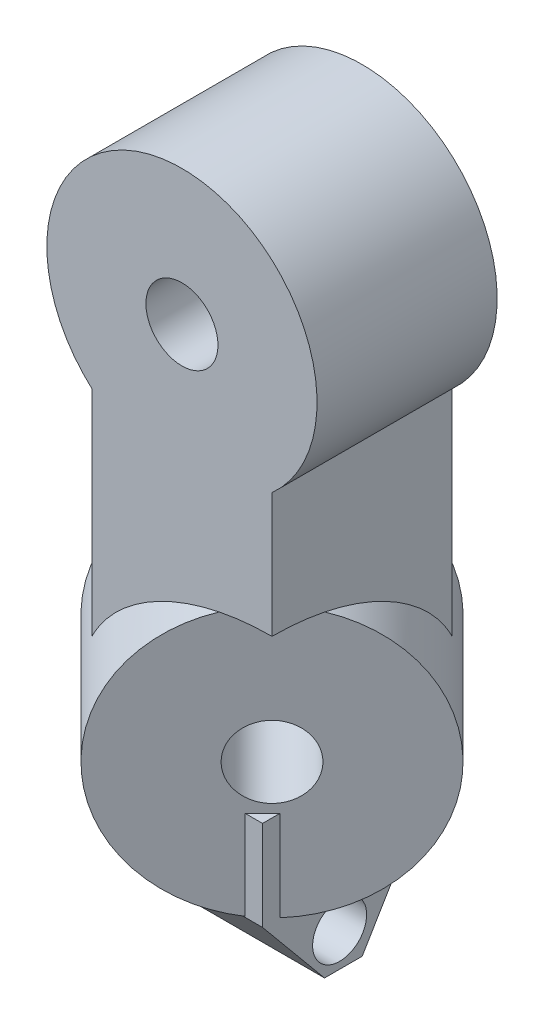
ISO-10303-21;
HEADER;
FILE_DESCRIPTION(('STEP AP214'),'2;1');
FILE_NAME('part.step','',(''),(''),'','','');
FILE_SCHEMA(('AUTOMOTIVE_DESIGN { 1 0 10303 214 1 1 1 1 }'));
ENDSEC;
DATA;
#1=APPLICATION_CONTEXT('core data for automotive mechanical design processes');
#2=APPLICATION_PROTOCOL_DEFINITION('international standard','automotive_design',2000,#1);
#3=PRODUCT_CONTEXT('',#1,'mechanical');
#4=PRODUCT('Part','Part','',(#3));
#5=PRODUCT_RELATED_PRODUCT_CATEGORY('part','',(#4));
#6=PRODUCT_DEFINITION_FORMATION('','',#4);
#7=PRODUCT_DEFINITION_CONTEXT('part definition',#1,'design');
#8=PRODUCT_DEFINITION('design','',#6,#7);
#9=PRODUCT_DEFINITION_SHAPE('','',#8);
#10=(LENGTH_UNIT() NAMED_UNIT(*) SI_UNIT(.MILLI.,.METRE.));
#11=(NAMED_UNIT(*) PLANE_ANGLE_UNIT() SI_UNIT($,.RADIAN.));
#12=(NAMED_UNIT(*) SI_UNIT($,.STERADIAN.) SOLID_ANGLE_UNIT());
#13=UNCERTAINTY_MEASURE_WITH_UNIT(LENGTH_MEASURE(1.E-05),#10,'distance_accuracy_value','');
#14=(GEOMETRIC_REPRESENTATION_CONTEXT(3) GLOBAL_UNCERTAINTY_ASSIGNED_CONTEXT((#13)) GLOBAL_UNIT_ASSIGNED_CONTEXT((#10,
#11,#12)) REPRESENTATION_CONTEXT('',''));
#15=CARTESIAN_POINT('',(0.,0.,0.));
#16=DIRECTION('',(0.,0.,1.));
#17=DIRECTION('',(1.,0.,0.));
#18=AXIS2_PLACEMENT_3D('',#15,#16,#17);
#19=CARTESIAN_POINT('',(-4.21974231725963,-12.5,1.27916126966144));
#20=DIRECTION('',(0.,0.,1.));
#21=DIRECTION('',(1.,0.,0.));
#22=AXIS2_PLACEMENT_3D('',#19,#20,#21);
#23=PLANE('',#22);
#24=DIRECTION('',(1.,0.,0.));
#25=VECTOR('',#24,1.);
#26=CARTESIAN_POINT('',(-6.21974231725963,-17.5189701101438,1.27916126966144));
#27=LINE('',#26,#25);
#28=CARTESIAN_POINT('',(-4.21974231725963,-17.5189701101438,1.27916126966144));
#29=VERTEX_POINT('',#28);
#30=CARTESIAN_POINT('',(-3.32377405507188,-17.5189701101438,1.27916126966144));
#31=VERTEX_POINT('',#30);
#32=EDGE_CURVE('E198',#29,#31,#27,.T.);
#33=ORIENTED_EDGE('',*,*,#32,.F.);
#34=DIRECTION('',(0.,-1.,0.));
#35=VECTOR('',#34,1.);
#36=CARTESIAN_POINT('',(-4.21974231725963,-12.5,1.27916126966144));
#37=LINE('',#36,#35);
#38=CARTESIAN_POINT('',(-4.21974231725963,-12.5,1.27916126966144));
#39=VERTEX_POINT('',#38);
#40=EDGE_CURVE('E226',#39,#29,#37,.T.);
#41=ORIENTED_EDGE('',*,*,#40,.F.);
#42=DIRECTION('',(-1.,0.,0.));
#43=VECTOR('',#42,1.);
#44=CARTESIAN_POINT('',(-4.21974231725963,-12.5,1.27916126966144));
#45=LINE('',#44,#43);
#46=CARTESIAN_POINT('',(-3.32377405507188,-12.5,1.27916126966144));
#47=VERTEX_POINT('',#46);
#48=EDGE_CURVE('E214',#47,#39,#45,.T.);
#49=ORIENTED_EDGE('',*,*,#48,.F.);
#50=DIRECTION('',(0.,1.,0.));
#51=VECTOR('',#50,1.);
#52=CARTESIAN_POINT('',(-3.32377405507188,-10.0235498921638,1.27916126966144));
#53=LINE('',#52,#51);
#54=EDGE_CURVE('E12',#31,#47,#53,.T.);
#55=ORIENTED_EDGE('',*,*,#54,.F.);
#56=EDGE_LOOP('',(#33,#41,#49,#55));
#57=FACE_BOUND('',#56,.T.);
#58=ADVANCED_FACE('F58',(#57),#23,.F.);
#59=CARTESIAN_POINT('',(3.78025768274037,-17.5189701101438,1.27916126966143));
#60=VERTEX_POINT('',#59);
#61=EDGE_CURVE('E187',#31,#60,#27,.T.);
#62=ORIENTED_EDGE('',*,*,#61,.F.);
#63=CARTESIAN_POINT('',(-3.69438370388353,-10.0235498921638,1.27916126966144));
#64=DIRECTION('',(0.,0.,1.));
#65=DIRECTION('',(1.,0.,0.));
#66=AXIS2_PLACEMENT_3D('',#63,#64,#65);
#67=ELLIPSE('',#66,10.6066017177982,7.5);
#68=CARTESIAN_POINT('',(3.78025768274037,-15.3447215742921,1.27916126966143));
#69=VERTEX_POINT('',#68);
#70=EDGE_CURVE('E239',#31,#69,#67,.T.);
#71=ORIENTED_EDGE('',*,*,#70,.T.);
#72=DIRECTION('',(0.,-1.,0.));
#73=VECTOR('',#72,1.);
#74=CARTESIAN_POINT('',(3.78025768274037,-12.5,1.27916126966143));
#75=LINE('',#74,#73);
#76=EDGE_CURVE('E229',#69,#60,#75,.T.);
#77=ORIENTED_EDGE('',*,*,#76,.T.);
#78=EDGE_LOOP('',(#62,#71,#77));
#79=FACE_BOUND('',#78,.T.);
#80=ADVANCED_FACE('F355',(#79),#23,.F.);
#81=CARTESIAN_POINT('',(-4.21974231725963,-12.5,1.27916126966144));
#82=DIRECTION('',(1.,0.,0.));
#83=DIRECTION('',(0.,0.,-1.));
#84=AXIS2_PLACEMENT_3D('',#81,#82,#83);
#85=PLANE('',#84);
#86=CARTESIAN_POINT('',(-4.21974231725963,-19.7716298168598,5.));
#87=DIRECTION('',(1.,0.,0.));
#88=DIRECTION('',(0.,0.,-1.));
#89=AXIS2_PLACEMENT_3D('',#86,#87,#88);
#90=CIRCLE('',#89,1.5);
#91=CARTESIAN_POINT('',(-4.21974231725963,-19.7716298168598,3.5));
#92=VERTEX_POINT('',#91);
#93=EDGE_CURVE('E207',#92,#92,#90,.T.);
#94=ORIENTED_EDGE('',*,*,#93,.T.);
#95=EDGE_LOOP('',(#94));
#96=FACE_BOUND('',#95,.T.);
#97=DIRECTION('',(0.,0.858793279687224,-0.512322264560171));
#98=VECTOR('',#97,1.);
#99=CARTESIAN_POINT('',(-4.21974231725963,-13.8173496764596,-0.929079768062978));
#100=LINE('',#99,#98);
#101=CARTESIAN_POINT('',(-4.21974231725963,-21.6536376881825,3.74574118695631));
#102=VERTEX_POINT('',#101);
#103=EDGE_CURVE('E211',#102,#29,#100,.T.);
#104=ORIENTED_EDGE('',*,*,#103,.F.);
#105=DIRECTION('',(0.,0.,-1.));
#106=VECTOR('',#105,1.);
#107=CARTESIAN_POINT('',(-4.21974231725963,-21.6536376881825,1.27916126966144));
#108=LINE('',#107,#106);
#109=CARTESIAN_POINT('',(-4.21974231725963,-21.6536376881825,5.83686104398145));
#110=VERTEX_POINT('',#109);
#111=EDGE_CURVE('E178',#110,#102,#108,.T.);
#112=ORIENTED_EDGE('',*,*,#111,.F.);
#113=DIRECTION('',(0.,-0.769956468328188,-0.638096416601428));
#114=VECTOR('',#113,1.);
#115=CARTESIAN_POINT('',(-4.21974231725963,-18.4662868914324,8.47835729152131));
#116=LINE('',#115,#114);
#117=CARTESIAN_POINT('',(-4.21974231725963,-17.5,9.27916126966144));
#118=VERTEX_POINT('',#117);
#119=EDGE_CURVE('E205',#118,#110,#116,.T.);
#120=ORIENTED_EDGE('',*,*,#119,.F.);
#121=DIRECTION('',(0.,-1.,0.));
#122=VECTOR('',#121,1.);
#123=CARTESIAN_POINT('',(-4.21974231725963,-12.5,9.27916126966144));
#124=LINE('',#123,#122);
#125=CARTESIAN_POINT('',(-4.21974231725963,-14.4855147347714,9.27916126966144));
#126=VERTEX_POINT('',#125);
#127=EDGE_CURVE('E223',#126,#118,#124,.T.);
#128=ORIENTED_EDGE('',*,*,#127,.F.);
#129=CARTESIAN_POINT('',(-4.21974231725963,-10.0235498921638,0.753802656285332));
#130=DIRECTION('',(1.,0.,0.));
#131=DIRECTION('',(0.,0.,1.));
#132=AXIS2_PLACEMENT_3D('',#129,#130,#131);
#133=ELLIPSE('',#132,10.6066017177982,7.5);
#134=CARTESIAN_POINT('',(-4.21974231725963,-17.455905841417,2.17512953184919));
#135=VERTEX_POINT('',#134);
#136=EDGE_CURVE('E237',#126,#135,#133,.T.);
#137=ORIENTED_EDGE('',*,*,#136,.T.);
#138=DIRECTION('',(0.,-1.,0.));
#139=VECTOR('',#138,1.);
#140=CARTESIAN_POINT('',(-4.21974231725963,-10.0235498921638,2.17512953184919));
#141=LINE('',#140,#139);
#142=CARTESIAN_POINT('',(-4.21974231725963,-12.5,2.17512953184919));
#143=VERTEX_POINT('',#142);
#144=EDGE_CURVE('E66',#143,#135,#141,.T.);
#145=ORIENTED_EDGE('',*,*,#144,.F.);
#146=DIRECTION('',(0.,0.,1.));
#147=VECTOR('',#146,1.);
#148=CARTESIAN_POINT('',(-4.21974231725963,-12.5,1.27916126966144));
#149=LINE('',#148,#147);
#150=EDGE_CURVE('E216',#39,#143,#149,.T.);
#151=ORIENTED_EDGE('',*,*,#150,.F.);
#152=ORIENTED_EDGE('',*,*,#40,.T.);
#153=EDGE_LOOP('',(#104,#112,#120,#128,#137,#145,#151,#152));
#154=FACE_BOUND('',#153,.T.);
#155=ADVANCED_FACE('F372',(#96,#154),#85,.F.);
#156=CARTESIAN_POINT('',(3.78025768274037,-12.5,1.27916126966143));
#157=DIRECTION('',(-1.,0.,0.));
#158=DIRECTION('',(0.,0.,1.));
#159=AXIS2_PLACEMENT_3D('',#156,#157,#158);
#160=PLANE('',#159);
#161=CARTESIAN_POINT('',(3.78025768274037,-19.7716298168598,5.));
#162=DIRECTION('',(1.,0.,0.));
#163=DIRECTION('',(0.,0.,-1.));
#164=AXIS2_PLACEMENT_3D('',#161,#162,#163);
#165=CIRCLE('',#164,1.5);
#166=CARTESIAN_POINT('',(3.78025768274037,-19.7716298168598,3.5));
#167=VERTEX_POINT('',#166);
#168=EDGE_CURVE('E202',#167,#167,#165,.T.);
#169=ORIENTED_EDGE('',*,*,#168,.F.);
#170=EDGE_LOOP('',(#169));
#171=FACE_BOUND('',#170,.T.);
#172=DIRECTION('',(0.,0.858793279687224,-0.512322264560171));
#173=VECTOR('',#172,1.);
#174=CARTESIAN_POINT('',(3.78025768274037,-4.03547196984396,-6.76456294758809));
#175=LINE('',#174,#173);
#176=CARTESIAN_POINT('',(3.78025768274037,-21.6536376881825,3.7457411869563));
#177=VERTEX_POINT('',#176);
#178=EDGE_CURVE('E184',#177,#60,#175,.T.);
#179=ORIENTED_EDGE('',*,*,#178,.T.);
#180=ORIENTED_EDGE('',*,*,#76,.F.);
#181=CARTESIAN_POINT('',(3.78025768274037,-10.0235498921638,8.75380265628534));
#182=DIRECTION('',(-1.,0.,0.));
#183=DIRECTION('',(0.,0.,1.));
#184=AXIS2_PLACEMENT_3D('',#181,#182,#183);
#185=ELLIPSE('',#184,10.6066017177982,7.5);
#186=CARTESIAN_POINT('',(3.78025768274037,-17.5171950335645,8.31726515558014));
#187=VERTEX_POINT('',#186);
#188=EDGE_CURVE('E235',#69,#187,#185,.T.);
#189=ORIENTED_EDGE('',*,*,#188,.T.);
#190=DIRECTION('',(0.,1.,0.));
#191=VECTOR('',#190,1.);
#192=CARTESIAN_POINT('',(3.78025768274037,-10.0235498921638,8.31726515558014));
#193=LINE('',#192,#191);
#194=CARTESIAN_POINT('',(3.78025768274037,-12.5,8.31726515558014));
#195=VERTEX_POINT('',#194);
#196=EDGE_CURVE('E315',#187,#195,#193,.T.);
#197=ORIENTED_EDGE('',*,*,#196,.T.);
#198=DIRECTION('',(0.,0.,-1.));
#199=VECTOR('',#198,1.);
#200=CARTESIAN_POINT('',(3.78025768274037,-12.5,1.27916126966143));
#201=LINE('',#200,#199);
#202=CARTESIAN_POINT('',(3.78025768274037,-12.5,9.27916126966143));
#203=VERTEX_POINT('',#202);
#204=EDGE_CURVE('E81',#203,#195,#201,.T.);
#205=ORIENTED_EDGE('',*,*,#204,.F.);
#206=DIRECTION('',(0.,-1.,0.));
#207=VECTOR('',#206,1.);
#208=CARTESIAN_POINT('',(3.78025768274037,-12.5,9.27916126966143));
#209=LINE('',#208,#207);
#210=CARTESIAN_POINT('',(3.78025768274037,-17.5,9.27916126966143));
#211=VERTEX_POINT('',#210);
#212=EDGE_CURVE('E221',#203,#211,#209,.T.);
#213=ORIENTED_EDGE('',*,*,#212,.T.);
#214=DIRECTION('',(0.,-0.769956468328188,-0.638096416601428));
#215=VECTOR('',#214,1.);
#216=CARTESIAN_POINT('',(3.78025768274038,-11.6843350519163,14.0988557799035));
#217=LINE('',#216,#215);
#218=CARTESIAN_POINT('',(3.78025768274037,-21.6536376881825,5.83686104398145));
#219=VERTEX_POINT('',#218);
#220=EDGE_CURVE('E73',#211,#219,#217,.T.);
#221=ORIENTED_EDGE('',*,*,#220,.T.);
#222=DIRECTION('',(0.,0.,-1.));
#223=VECTOR('',#222,1.);
#224=CARTESIAN_POINT('',(3.78025768274037,-21.6536376881825,0.));
#225=LINE('',#224,#223);
#226=EDGE_CURVE('E176',#219,#177,#225,.T.);
#227=ORIENTED_EDGE('',*,*,#226,.T.);
#228=EDGE_LOOP('',(#179,#180,#189,#197,#205,#213,#221,#227));
#229=FACE_BOUND('',#228,.T.);
#230=ADVANCED_FACE('F192',(#171,#229),#160,.F.);
#231=CARTESIAN_POINT('',(-4.21974231725963,-12.5,9.27916126966144));
#232=DIRECTION('',(0.,0.,-1.));
#233=DIRECTION('',(-1.,0.,0.));
#234=AXIS2_PLACEMENT_3D('',#231,#232,#233);
#235=PLANE('',#234);
#236=DIRECTION('',(1.,0.,0.));
#237=VECTOR('',#236,1.);
#238=CARTESIAN_POINT('',(-6.21974231725963,-17.5,9.27916126966144));
#239=LINE('',#238,#237);
#240=EDGE_CURVE('E199',#118,#211,#239,.T.);
#241=ORIENTED_EDGE('',*,*,#240,.T.);
#242=ORIENTED_EDGE('',*,*,#212,.F.);
#243=DIRECTION('',(1.,0.,0.));
#244=VECTOR('',#243,1.);
#245=CARTESIAN_POINT('',(-4.21974231725963,-12.5,9.27916126966144));
#246=LINE('',#245,#244);
#247=CARTESIAN_POINT('',(2.81836156865907,-12.5,9.27916126966144));
#248=VERTEX_POINT('',#247);
#249=EDGE_CURVE('E219',#248,#203,#246,.T.);
#250=ORIENTED_EDGE('',*,*,#249,.F.);
#251=DIRECTION('',(0.,-1.,0.));
#252=VECTOR('',#251,1.);
#253=CARTESIAN_POINT('',(2.81836156865908,-10.0235498921638,9.27916126966143));
#254=LINE('',#253,#252);
#255=CARTESIAN_POINT('',(2.81836156865908,-17.4494529812047,9.27916126966143));
#256=VERTEX_POINT('',#255);
#257=EDGE_CURVE('E313',#248,#256,#254,.T.);
#258=ORIENTED_EDGE('',*,*,#257,.T.);
#259=CARTESIAN_POINT('',(4.30561629611647,-10.0235498921638,9.27916126966144));
#260=DIRECTION('',(0.,0.,-1.));
#261=DIRECTION('',(1.,0.,0.));
#262=AXIS2_PLACEMENT_3D('',#259,#260,#261);
#263=ELLIPSE('',#262,10.6066017177982,7.5);
#264=EDGE_CURVE('E233',#256,#126,#263,.T.);
#265=ORIENTED_EDGE('',*,*,#264,.T.);
#266=ORIENTED_EDGE('',*,*,#127,.T.);
#267=EDGE_LOOP('',(#241,#242,#250,#258,#265,#266));
#268=FACE_BOUND('',#267,.T.);
#269=ADVANCED_FACE('F369',(#268),#235,.F.);
#270=CARTESIAN_POINT('',(-3.5090788794777,-10.0235498921638,1.46446609406726));
#271=DIRECTION('',(0.707106781186547,0.,0.707106781186548));
#272=DIRECTION('',(0.707106781186548,0.,-0.707106781186547));
#273=AXIS2_PLACEMENT_3D('',#270,#271,#272);
#274=CYLINDRICAL_SURFACE('',#273,7.5);
#275=ORIENTED_EDGE('',*,*,#188,.F.);
#276=ORIENTED_EDGE('',*,*,#70,.F.);
#277=CARTESIAN_POINT('',(-3.5090788794777,-10.0235498921638,1.46446609406726));
#278=DIRECTION('',(-0.707106781186547,0.,-0.707106781186548));
#279=DIRECTION('',(-0.707106781186548,0.,0.707106781186547));
#280=AXIS2_PLACEMENT_3D('',#277,#278,#279);
#281=CIRCLE('',#280,7.5);
#282=CARTESIAN_POINT('',(-2.04461278541044,-2.81517433877762,0.));
#283=VERTEX_POINT('',#282);
#284=EDGE_CURVE('E262',#283,#31,#281,.T.);
#285=ORIENTED_EDGE('',*,*,#284,.F.);
#286=CARTESIAN_POINT('',(-4.97354497354496,-10.0235498921638,0.));
#287=DIRECTION('',(0.,0.,1.));
#288=DIRECTION('',(1.,0.,0.));
#289=AXIS2_PLACEMENT_3D('',#286,#287,#288);
#290=ELLIPSE('',#289,10.6066017177982,7.5);
#291=CARTESIAN_POINT('',(5.02645502645504,-7.52354989216375,0.));
#292=VERTEX_POINT('',#291);
#293=EDGE_CURVE('E275',#283,#292,#290,.F.);
#294=ORIENTED_EDGE('',*,*,#293,.T.);
#295=CARTESIAN_POINT('',(5.02645502645504,-10.0235498921638,10.));
#296=DIRECTION('',(-1.,0.,0.));
#297=DIRECTION('',(0.,0.,1.));
#298=AXIS2_PLACEMENT_3D('',#295,#296,#297);
#299=ELLIPSE('',#298,10.6066017177982,7.5);
#300=CARTESIAN_POINT('',(5.02645502645504,-2.81517433877762,7.07106781186548));
#301=VERTEX_POINT('',#300);
#302=EDGE_CURVE('E272',#292,#301,#299,.F.);
#303=ORIENTED_EDGE('',*,*,#302,.T.);
#304=CARTESIAN_POINT('',(3.56198893238777,-10.0235498921638,8.53553390593274));
#305=DIRECTION('',(-0.707106781186547,0.,-0.707106781186548));
#306=DIRECTION('',(-0.707106781186548,0.,0.707106781186547));
#307=AXIS2_PLACEMENT_3D('',#304,#305,#306);
#308=CIRCLE('',#307,7.5);
#309=EDGE_CURVE('E267',#301,#187,#308,.T.);
#310=ORIENTED_EDGE('',*,*,#309,.T.);
#311=EDGE_LOOP('',(#275,#276,#285,#294,#303,#310));
#312=FACE_BOUND('',#311,.T.);
#313=ADVANCED_FACE('F353',(#312),#274,.T.);
#314=ORIENTED_EDGE('',*,*,#136,.F.);
#315=ORIENTED_EDGE('',*,*,#264,.F.);
#316=CARTESIAN_POINT('',(2.09752283832051,-2.81517433877762,10.));
#317=VERTEX_POINT('',#316);
#318=EDGE_CURVE('E261',#256,#317,#308,.T.);
#319=ORIENTED_EDGE('',*,*,#318,.T.);
#320=CARTESIAN_POINT('',(5.02645502645503,-10.0235498921638,10.));
#321=DIRECTION('',(0.,0.,1.));
#322=DIRECTION('',(1.,0.,0.));
#323=AXIS2_PLACEMENT_3D('',#320,#321,#322);
#324=ELLIPSE('',#323,10.6066017177982,7.5);
#325=CARTESIAN_POINT('',(-4.97354497354496,-7.52354989216375,10.));
#326=VERTEX_POINT('',#325);
#327=EDGE_CURVE('E265',#326,#317,#324,.F.);
#328=ORIENTED_EDGE('',*,*,#327,.F.);
#329=CARTESIAN_POINT('',(-4.97354497354496,-10.0235498921638,0.));
#330=DIRECTION('',(1.,0.,0.));
#331=DIRECTION('',(0.,0.,1.));
#332=AXIS2_PLACEMENT_3D('',#329,#330,#331);
#333=ELLIPSE('',#332,10.6066017177982,7.5);
#334=CARTESIAN_POINT('',(-4.97354497354497,-2.81517433877762,2.92893218813452));
#335=VERTEX_POINT('',#334);
#336=EDGE_CURVE('E304',#326,#335,#333,.F.);
#337=ORIENTED_EDGE('',*,*,#336,.T.);
#338=EDGE_CURVE('E266',#135,#335,#281,.T.);
#339=ORIENTED_EDGE('',*,*,#338,.F.);
#340=EDGE_LOOP('',(#314,#315,#319,#328,#337,#339));
#341=FACE_BOUND('',#340,.T.);
#342=ADVANCED_FACE('F326',(#341),#274,.T.);
#343=CARTESIAN_POINT('',(-3.5090788794777,-10.0235498921638,1.46446609406726));
#344=DIRECTION('',(-0.707106781186547,0.,-0.707106781186548));
#345=DIRECTION('',(-0.707106781186548,0.,0.707106781186547));
#346=AXIS2_PLACEMENT_3D('',#343,#344,#345);
#347=PLANE('',#346);
#348=CARTESIAN_POINT('',(-3.5090788794777,-10.0235498921638,1.46446609406726));
#349=DIRECTION('',(-0.707106781186547,0.,-0.707106781186548));
#350=DIRECTION('',(-0.707106781186548,0.,0.707106781186547));
#351=AXIS2_PLACEMENT_3D('',#348,#349,#350);
#352=CIRCLE('',#351,2.);
#353=CARTESIAN_POINT('',(-4.9232924418508,-10.0235498921638,2.87867965644035));
#354=VERTEX_POINT('',#353);
#355=EDGE_CURVE('E258',#354,#354,#352,.T.);
#356=ORIENTED_EDGE('',*,*,#355,.F.);
#357=EDGE_LOOP('',(#356));
#358=FACE_BOUND('',#357,.T.);
#359=ORIENTED_EDGE('',*,*,#284,.T.);
#360=ORIENTED_EDGE('',*,*,#54,.T.);
#361=DIRECTION('',(0.707106781186548,0.,-0.707106781186547));
#362=VECTOR('',#361,1.);
#363=CARTESIAN_POINT('',(-3.5090788794777,-12.5,1.46446609406726));
#364=LINE('',#363,#362);
#365=EDGE_CURVE('E231',#143,#47,#364,.T.);
#366=ORIENTED_EDGE('',*,*,#365,.F.);
#367=ORIENTED_EDGE('',*,*,#144,.T.);
#368=ORIENTED_EDGE('',*,*,#338,.T.);
#369=CARTESIAN_POINT('',(-3.5090788794777,-10.0235498921638,1.46446609406726));
#370=DIRECTION('',(0.707106781186547,0.,0.707106781186548));
#371=DIRECTION('',(0.707106781186548,0.,-0.707106781186547));
#372=AXIS2_PLACEMENT_3D('',#369,#370,#371);
#373=CIRCLE('',#372,7.5);
#374=EDGE_CURVE('E241',#283,#335,#373,.T.);
#375=ORIENTED_EDGE('',*,*,#374,.F.);
#376=EDGE_LOOP('',(#359,#360,#366,#367,#368,#375));
#377=FACE_BOUND('',#376,.T.);
#378=ADVANCED_FACE('F320',(#358,#377),#347,.T.);
#379=CARTESIAN_POINT('',(3.56198893238777,-10.0235498921638,8.53553390593274));
#380=DIRECTION('',(-0.707106781186547,0.,-0.707106781186548));
#381=DIRECTION('',(-0.707106781186548,0.,0.707106781186547));
#382=AXIS2_PLACEMENT_3D('',#379,#380,#381);
#383=PLANE('',#382);
#384=CARTESIAN_POINT('',(3.56198893238777,-10.0235498921638,8.53553390593274));
#385=DIRECTION('',(-0.707106781186547,0.,-0.707106781186548));
#386=DIRECTION('',(-0.707106781186548,0.,0.707106781186547));
#387=AXIS2_PLACEMENT_3D('',#384,#385,#386);
#388=CIRCLE('',#387,2.);
#389=CARTESIAN_POINT('',(2.14777537001468,-10.0235498921638,9.94974746830583));
#390=VERTEX_POINT('',#389);
#391=EDGE_CURVE('E307',#390,#390,#388,.T.);
#392=ORIENTED_EDGE('',*,*,#391,.T.);
#393=EDGE_LOOP('',(#392));
#394=FACE_BOUND('',#393,.T.);
#395=ORIENTED_EDGE('',*,*,#196,.F.);
#396=ORIENTED_EDGE('',*,*,#309,.F.);
#397=CARTESIAN_POINT('',(3.56198893238778,-10.0235498921638,8.53553390593274));
#398=DIRECTION('',(0.707106781186548,0.,0.707106781186548));
#399=DIRECTION('',(0.707106781186548,0.,-0.707106781186548));
#400=AXIS2_PLACEMENT_3D('',#397,#398,#399);
#401=CIRCLE('',#400,7.5);
#402=EDGE_CURVE('E250',#301,#317,#401,.T.);
#403=ORIENTED_EDGE('',*,*,#402,.T.);
#404=ORIENTED_EDGE('',*,*,#318,.F.);
#405=ORIENTED_EDGE('',*,*,#257,.F.);
#406=DIRECTION('',(0.707106781186548,0.,-0.707106781186547));
#407=VECTOR('',#406,1.);
#408=CARTESIAN_POINT('',(3.56198893238777,-12.5,8.53553390593274));
#409=LINE('',#408,#407);
#410=EDGE_CURVE('E310',#248,#195,#409,.T.);
#411=ORIENTED_EDGE('',*,*,#410,.T.);
#412=EDGE_LOOP('',(#395,#396,#403,#404,#405,#411));
#413=FACE_BOUND('',#412,.T.);
#414=ADVANCED_FACE('F359',(#394,#413),#383,.F.);
#415=CARTESIAN_POINT('',(9.21884318188016,-10.0235498921638,14.1923881554251));
#416=DIRECTION('',(-0.707106781186548,0.,-0.707106781186548));
#417=DIRECTION('',(-0.707106781186548,0.,0.707106781186548));
#418=AXIS2_PLACEMENT_3D('',#415,#416,#417);
#419=CYLINDRICAL_SURFACE('',#418,2.);
#420=ORIENTED_EDGE('',*,*,#391,.F.);
#421=EDGE_LOOP('',(#420));
#422=FACE_BOUND('',#421,.T.);
#423=ORIENTED_EDGE('',*,*,#355,.T.);
#424=EDGE_LOOP('',(#423));
#425=FACE_BOUND('',#424,.T.);
#426=ADVANCED_FACE('F402',(#422,#425),#419,.F.);
#427=CARTESIAN_POINT('',(0.0264550264550368,9.97645010783625,10.));
#428=DIRECTION('',(0.,0.,1.));
#429=DIRECTION('',(1.,0.,0.));
#430=AXIS2_PLACEMENT_3D('',#427,#428,#429);
#431=PLANE('',#430);
#432=CARTESIAN_POINT('',(0.0264550264550368,9.97645010783625,10.));
#433=DIRECTION('',(0.,0.,1.));
#434=DIRECTION('',(1.,0.,0.));
#435=AXIS2_PLACEMENT_3D('',#432,#433,#434);
#436=CIRCLE('',#435,2.);
#437=CARTESIAN_POINT('',(2.02645502645504,9.97645010783625,10.));
#438=VERTEX_POINT('',#437);
#439=EDGE_CURVE('E281',#438,#438,#436,.T.);
#440=ORIENTED_EDGE('',*,*,#439,.F.);
#441=EDGE_LOOP('',(#440));
#442=FACE_BOUND('',#441,.T.);
#443=ORIENTED_EDGE('',*,*,#327,.T.);
#444=CARTESIAN_POINT('',(5.02645502645503,-10.0235498921638,10.));
#445=DIRECTION('',(0.,0.,1.));
#446=DIRECTION('',(-1.,0.,0.));
#447=AXIS2_PLACEMENT_3D('',#444,#445,#446);
#448=ELLIPSE('',#447,10.6066017177982,7.5);
#449=CARTESIAN_POINT('',(5.02645502645504,-2.52354989216375,10.));
#450=VERTEX_POINT('',#449);
#451=EDGE_CURVE('E255',#317,#450,#448,.F.);
#452=ORIENTED_EDGE('',*,*,#451,.T.);
#453=DIRECTION('',(0.,1.,0.));
#454=VECTOR('',#453,1.);
#455=CARTESIAN_POINT('',(5.02645502645504,-10.0235498921638,10.));
#456=LINE('',#455,#454);
#457=CARTESIAN_POINT('',(5.02645502645504,4.38628016408677,10.));
#458=VERTEX_POINT('',#457);
#459=EDGE_CURVE('E285',#450,#458,#456,.T.);
#460=ORIENTED_EDGE('',*,*,#459,.T.);
#461=CARTESIAN_POINT('',(0.0264550264550368,9.97645010783625,10.));
#462=DIRECTION('',(0.,0.,1.));
#463=DIRECTION('',(1.,0.,0.));
#464=AXIS2_PLACEMENT_3D('',#461,#462,#463);
#465=CIRCLE('',#464,7.5);
#466=CARTESIAN_POINT('',(-4.97354497354496,4.38628016408677,10.));
#467=VERTEX_POINT('',#466);
#468=EDGE_CURVE('E287',#458,#467,#465,.T.);
#469=ORIENTED_EDGE('',*,*,#468,.T.);
#470=DIRECTION('',(0.,-1.,0.));
#471=VECTOR('',#470,1.);
#472=CARTESIAN_POINT('',(-4.97354497354496,-10.0235498921638,10.));
#473=LINE('',#472,#471);
#474=EDGE_CURVE('E290',#467,#326,#473,.T.);
#475=ORIENTED_EDGE('',*,*,#474,.T.);
#476=EDGE_LOOP('',(#443,#452,#460,#469,#475));
#477=FACE_BOUND('',#476,.T.);
#478=ADVANCED_FACE('F333',(#442,#477),#431,.T.);
#479=CARTESIAN_POINT('',(5.02645502645504,-10.0235498921638,10.));
#480=DIRECTION('',(-1.,0.,0.));
#481=DIRECTION('',(0.,0.,1.));
#482=AXIS2_PLACEMENT_3D('',#479,#480,#481);
#483=PLANE('',#482);
#484=CARTESIAN_POINT('',(5.02645502645504,-10.0235498921638,10.));
#485=DIRECTION('',(-1.,0.,0.));
#486=DIRECTION('',(0.,0.,-1.));
#487=AXIS2_PLACEMENT_3D('',#484,#485,#486);
#488=ELLIPSE('',#487,10.6066017177982,7.5);
#489=EDGE_CURVE('E253',#301,#450,#488,.F.);
#490=ORIENTED_EDGE('',*,*,#489,.F.);
#491=ORIENTED_EDGE('',*,*,#302,.F.);
#492=DIRECTION('',(0.,1.,0.));
#493=VECTOR('',#492,1.);
#494=CARTESIAN_POINT('',(5.02645502645504,-10.0235498921638,0.));
#495=LINE('',#494,#493);
#496=CARTESIAN_POINT('',(5.02645502645504,4.38628016408677,0.));
#497=VERTEX_POINT('',#496);
#498=EDGE_CURVE('E284',#292,#497,#495,.T.);
#499=ORIENTED_EDGE('',*,*,#498,.T.);
#500=DIRECTION('',(0.,0.,-1.));
#501=VECTOR('',#500,1.);
#502=CARTESIAN_POINT('',(5.02645502645504,4.38628016408677,10.));
#503=LINE('',#502,#501);
#504=EDGE_CURVE('E301',#458,#497,#503,.T.);
#505=ORIENTED_EDGE('',*,*,#504,.F.);
#506=ORIENTED_EDGE('',*,*,#459,.F.);
#507=EDGE_LOOP('',(#490,#491,#499,#505,#506));
#508=FACE_BOUND('',#507,.T.);
#509=ADVANCED_FACE('F60',(#508),#483,.F.);
#510=CARTESIAN_POINT('',(0.0264550264550368,9.97645010783625,0.));
#511=DIRECTION('',(0.,0.,1.));
#512=DIRECTION('',(1.,0.,0.));
#513=AXIS2_PLACEMENT_3D('',#510,#511,#512);
#514=PLANE('',#513);
#515=CARTESIAN_POINT('',(0.0264550264550368,9.97645010783625,0.));
#516=DIRECTION('',(0.,0.,-1.));
#517=DIRECTION('',(-1.,0.,0.));
#518=AXIS2_PLACEMENT_3D('',#515,#516,#517);
#519=CIRCLE('',#518,2.);
#520=CARTESIAN_POINT('',(-1.97354497354496,9.97645010783625,0.));
#521=VERTEX_POINT('',#520);
#522=EDGE_CURVE('E278',#521,#521,#519,.T.);
#523=ORIENTED_EDGE('',*,*,#522,.F.);
#524=EDGE_LOOP('',(#523));
#525=FACE_BOUND('',#524,.T.);
#526=ORIENTED_EDGE('',*,*,#293,.F.);
#527=CARTESIAN_POINT('',(-4.97354497354496,-10.0235498921638,0.));
#528=DIRECTION('',(0.,0.,1.));
#529=DIRECTION('',(1.,0.,0.));
#530=AXIS2_PLACEMENT_3D('',#527,#528,#529);
#531=ELLIPSE('',#530,10.6066017177982,7.5);
#532=CARTESIAN_POINT('',(-4.97354497354496,-2.52354989216375,0.));
#533=VERTEX_POINT('',#532);
#534=EDGE_CURVE('E247',#283,#533,#531,.T.);
#535=ORIENTED_EDGE('',*,*,#534,.T.);
#536=DIRECTION('',(0.,-1.,0.));
#537=VECTOR('',#536,1.);
#538=CARTESIAN_POINT('',(-4.97354497354496,-10.0235498921638,0.));
#539=LINE('',#538,#537);
#540=CARTESIAN_POINT('',(-4.97354497354496,4.38628016408677,0.));
#541=VERTEX_POINT('',#540);
#542=EDGE_CURVE('E288',#541,#533,#539,.T.);
#543=ORIENTED_EDGE('',*,*,#542,.F.);
#544=CARTESIAN_POINT('',(0.0264550264550368,9.97645010783625,0.));
#545=DIRECTION('',(0.,0.,1.));
#546=DIRECTION('',(1.,0.,0.));
#547=AXIS2_PLACEMENT_3D('',#544,#545,#546);
#548=CIRCLE('',#547,7.5);
#549=EDGE_CURVE('E295',#497,#541,#548,.T.);
#550=ORIENTED_EDGE('',*,*,#549,.F.);
#551=ORIENTED_EDGE('',*,*,#498,.F.);
#552=EDGE_LOOP('',(#526,#535,#543,#550,#551));
#553=FACE_BOUND('',#552,.T.);
#554=ADVANCED_FACE('F344',(#525,#553),#514,.F.);
#555=CARTESIAN_POINT('',(-4.97354497354496,-10.0235498921638,10.));
#556=DIRECTION('',(1.,0.,0.));
#557=DIRECTION('',(0.,0.,-1.));
#558=AXIS2_PLACEMENT_3D('',#555,#556,#557);
#559=PLANE('',#558);
#560=ORIENTED_EDGE('',*,*,#542,.T.);
#561=CARTESIAN_POINT('',(-4.97354497354496,-10.0235498921638,0.));
#562=DIRECTION('',(1.,0.,0.));
#563=DIRECTION('',(0.,0.,1.));
#564=AXIS2_PLACEMENT_3D('',#561,#562,#563);
#565=ELLIPSE('',#564,10.6066017177982,7.5);
#566=EDGE_CURVE('E244',#533,#335,#565,.T.);
#567=ORIENTED_EDGE('',*,*,#566,.T.);
#568=ORIENTED_EDGE('',*,*,#336,.F.);
#569=ORIENTED_EDGE('',*,*,#474,.F.);
#570=DIRECTION('',(0.,0.,-1.));
#571=VECTOR('',#570,1.);
#572=CARTESIAN_POINT('',(-4.97354497354496,4.38628016408677,10.));
#573=LINE('',#572,#571);
#574=EDGE_CURVE('E293',#467,#541,#573,.T.);
#575=ORIENTED_EDGE('',*,*,#574,.T.);
#576=EDGE_LOOP('',(#560,#567,#568,#569,#575));
#577=FACE_BOUND('',#576,.T.);
#578=ADVANCED_FACE('F331',(#577),#559,.F.);
#579=CARTESIAN_POINT('',(0.0264550264550368,9.97645010783625,10.));
#580=DIRECTION('',(0.,0.,-1.));
#581=DIRECTION('',(-1.,0.,0.));
#582=AXIS2_PLACEMENT_3D('',#579,#580,#581);
#583=CYLINDRICAL_SURFACE('',#582,7.5);
#584=ORIENTED_EDGE('',*,*,#549,.T.);
#585=ORIENTED_EDGE('',*,*,#574,.F.);
#586=ORIENTED_EDGE('',*,*,#468,.F.);
#587=ORIENTED_EDGE('',*,*,#504,.T.);
#588=EDGE_LOOP('',(#584,#585,#586,#587));
#589=FACE_BOUND('',#588,.T.);
#590=ADVANCED_FACE('F339',(#589),#583,.T.);
#591=CARTESIAN_POINT('',(0.0264550264550368,9.97645010783625,30.));
#592=DIRECTION('',(0.,0.,-1.));
#593=DIRECTION('',(-1.,0.,0.));
#594=AXIS2_PLACEMENT_3D('',#591,#592,#593);
#595=CYLINDRICAL_SURFACE('',#594,2.);
#596=ORIENTED_EDGE('',*,*,#439,.T.);
#597=EDGE_LOOP('',(#596));
#598=FACE_BOUND('',#597,.T.);
#599=ORIENTED_EDGE('',*,*,#522,.T.);
#600=EDGE_LOOP('',(#599));
#601=FACE_BOUND('',#600,.T.);
#602=ADVANCED_FACE('F401',(#598,#601),#595,.F.);
#603=CARTESIAN_POINT('',(9.92594996306671,-10.0235498921638,14.8994949366117));
#604=DIRECTION('',(-0.707106781186548,0.,-0.707106781186548));
#605=DIRECTION('',(-0.707106781186548,0.,0.707106781186548));
#606=AXIS2_PLACEMENT_3D('',#603,#604,#605);
#607=CYLINDRICAL_SURFACE('',#606,7.5);
#608=ORIENTED_EDGE('',*,*,#402,.F.);
#609=ORIENTED_EDGE('',*,*,#489,.T.);
#610=ORIENTED_EDGE('',*,*,#451,.F.);
#611=EDGE_LOOP('',(#608,#609,#610));
#612=FACE_BOUND('',#611,.T.);
#613=ADVANCED_FACE('F365',(#612),#607,.F.);
#614=CARTESIAN_POINT('',(-9.87303991015663,-10.0235498921638,-4.89949493661168));
#615=DIRECTION('',(0.707106781186547,0.,0.707106781186548));
#616=DIRECTION('',(0.707106781186548,0.,-0.707106781186547));
#617=AXIS2_PLACEMENT_3D('',#614,#615,#616);
#618=CYLINDRICAL_SURFACE('',#617,7.5);
#619=ORIENTED_EDGE('',*,*,#374,.T.);
#620=ORIENTED_EDGE('',*,*,#566,.F.);
#621=ORIENTED_EDGE('',*,*,#534,.F.);
#622=EDGE_LOOP('',(#619,#620,#621));
#623=FACE_BOUND('',#622,.T.);
#624=ADVANCED_FACE('F348',(#623),#618,.F.);
#625=CARTESIAN_POINT('',(0.,-12.5,0.));
#626=DIRECTION('',(0.,1.,0.));
#627=DIRECTION('',(0.,0.,1.));
#628=AXIS2_PLACEMENT_3D('',#625,#626,#627);
#629=PLANE('',#628);
#630=ORIENTED_EDGE('',*,*,#410,.F.);
#631=ORIENTED_EDGE('',*,*,#249,.T.);
#632=ORIENTED_EDGE('',*,*,#204,.T.);
#633=EDGE_LOOP('',(#630,#631,#632));
#634=FACE_BOUND('',#633,.T.);
#635=ADVANCED_FACE('F375',(#634),#629,.T.);
#636=ORIENTED_EDGE('',*,*,#150,.T.);
#637=ORIENTED_EDGE('',*,*,#365,.T.);
#638=ORIENTED_EDGE('',*,*,#48,.T.);
#639=EDGE_LOOP('',(#636,#637,#638));
#640=FACE_BOUND('',#639,.T.);
#641=ADVANCED_FACE('F377',(#640),#629,.T.);
#642=CARTESIAN_POINT('',(-6.21974231725963,-4.03547196984396,-6.76456294758809));
#643=DIRECTION('',(0.,-0.512322264560171,-0.858793279687224));
#644=DIRECTION('',(0.,0.858793279687224,-0.512322264560171));
#645=AXIS2_PLACEMENT_3D('',#642,#643,#644);
#646=PLANE('',#645);
#647=ORIENTED_EDGE('',*,*,#103,.T.);
#648=ORIENTED_EDGE('',*,*,#32,.T.);
#649=ORIENTED_EDGE('',*,*,#61,.T.);
#650=ORIENTED_EDGE('',*,*,#178,.F.);
#651=DIRECTION('',(1.,0.,0.));
#652=VECTOR('',#651,1.);
#653=CARTESIAN_POINT('',(-6.21974231725963,-21.6536376881825,3.74574118695631));
#654=LINE('',#653,#652);
#655=EDGE_CURVE('E171',#102,#177,#654,.T.);
#656=ORIENTED_EDGE('',*,*,#655,.F.);
#657=EDGE_LOOP('',(#647,#648,#649,#650,#656));
#658=FACE_BOUND('',#657,.T.);
#659=ADVANCED_FACE('F185',(#658),#646,.T.);
#660=CARTESIAN_POINT('',(-6.21974231725963,-21.6536376881825,0.));
#661=DIRECTION('',(0.,-1.,0.));
#662=DIRECTION('',(0.,0.,-1.));
#663=AXIS2_PLACEMENT_3D('',#660,#661,#662);
#664=PLANE('',#663);
#665=ORIENTED_EDGE('',*,*,#111,.T.);
#666=ORIENTED_EDGE('',*,*,#655,.T.);
#667=ORIENTED_EDGE('',*,*,#226,.F.);
#668=DIRECTION('',(1.,0.,0.));
#669=VECTOR('',#668,1.);
#670=CARTESIAN_POINT('',(-6.21974231725963,-21.6536376881825,5.83686104398146));
#671=LINE('',#670,#669);
#672=EDGE_CURVE('E181',#110,#219,#671,.T.);
#673=ORIENTED_EDGE('',*,*,#672,.F.);
#674=EDGE_LOOP('',(#665,#666,#667,#673));
#675=FACE_BOUND('',#674,.T.);
#676=ADVANCED_FACE('F173',(#675),#664,.T.);
#677=CARTESIAN_POINT('',(-6.21974231725962,-11.6843350519163,14.0988557799035));
#678=DIRECTION('',(0.,-0.638096416601428,0.769956468328188));
#679=DIRECTION('',(0.,-0.769956468328188,-0.638096416601428));
#680=AXIS2_PLACEMENT_3D('',#677,#678,#679);
#681=PLANE('',#680);
#682=ORIENTED_EDGE('',*,*,#119,.T.);
#683=ORIENTED_EDGE('',*,*,#672,.T.);
#684=ORIENTED_EDGE('',*,*,#220,.F.);
#685=ORIENTED_EDGE('',*,*,#240,.F.);
#686=EDGE_LOOP('',(#682,#683,#684,#685));
#687=FACE_BOUND('',#686,.T.);
#688=ADVANCED_FACE('F373',(#687),#681,.T.);
#689=CARTESIAN_POINT('',(-6.21974231725963,-19.7716298168598,5.));
#690=DIRECTION('',(1.,0.,0.));
#691=DIRECTION('',(0.,0.,-1.));
#692=AXIS2_PLACEMENT_3D('',#689,#690,#691);
#693=CYLINDRICAL_SURFACE('',#692,1.5);
#694=ORIENTED_EDGE('',*,*,#168,.T.);
#695=EDGE_LOOP('',(#694));
#696=FACE_BOUND('',#695,.T.);
#697=ORIENTED_EDGE('',*,*,#93,.F.);
#698=EDGE_LOOP('',(#697));
#699=FACE_BOUND('',#698,.T.);
#700=ADVANCED_FACE('F541',(#696,#699),#693,.F.);
#701=CLOSED_SHELL('',(#58,#80,#155,#230,#269,#313,#342,#378,#414,#426,#478,#509,#554,#578,#590,
#602,#613,#624,#635,#641,#659,#676,#688,#700));
#702=MANIFOLD_SOLID_BREP('B2',#701);
#703=ADVANCED_BREP_SHAPE_REPRESENTATION('',(#18,#702),#14);
#704=SHAPE_DEFINITION_REPRESENTATION(#9,#703);
ENDSEC;
END-ISO-10303-21;
